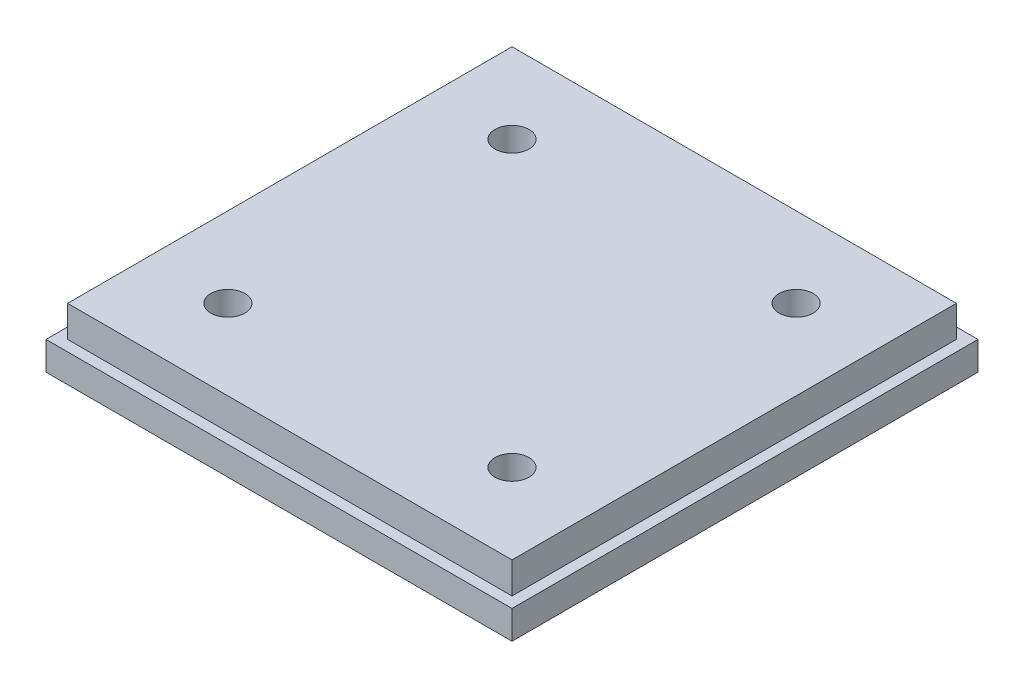
ISO-10303-21;
HEADER;
FILE_DESCRIPTION(('STEP AP214'),'2;1');
FILE_NAME('part.step','',(''),(''),'','','');
FILE_SCHEMA(('AUTOMOTIVE_DESIGN { 1 0 10303 214 1 1 1 1 }'));
ENDSEC;
DATA;
#1=APPLICATION_CONTEXT('core data for automotive mechanical design processes');
#2=APPLICATION_PROTOCOL_DEFINITION('international standard','automotive_design',2000,#1);
#3=PRODUCT_CONTEXT('',#1,'mechanical');
#4=PRODUCT('Part','Part','',(#3));
#5=PRODUCT_RELATED_PRODUCT_CATEGORY('part','',(#4));
#6=PRODUCT_DEFINITION_FORMATION('','',#4);
#7=PRODUCT_DEFINITION_CONTEXT('part definition',#1,'design');
#8=PRODUCT_DEFINITION('design','',#6,#7);
#9=PRODUCT_DEFINITION_SHAPE('','',#8);
#10=(LENGTH_UNIT() NAMED_UNIT(*) SI_UNIT(.MILLI.,.METRE.));
#11=(NAMED_UNIT(*) PLANE_ANGLE_UNIT() SI_UNIT($,.RADIAN.));
#12=(NAMED_UNIT(*) SI_UNIT($,.STERADIAN.) SOLID_ANGLE_UNIT());
#13=UNCERTAINTY_MEASURE_WITH_UNIT(LENGTH_MEASURE(1.E-05),#10,'distance_accuracy_value','');
#14=(GEOMETRIC_REPRESENTATION_CONTEXT(3) GLOBAL_UNCERTAINTY_ASSIGNED_CONTEXT((#13)) GLOBAL_UNIT_ASSIGNED_CONTEXT((#10,
#11,#12)) REPRESENTATION_CONTEXT('',''));
#15=CARTESIAN_POINT('',(0.,0.,0.));
#16=DIRECTION('',(0.,0.,1.));
#17=DIRECTION('',(1.,0.,0.));
#18=AXIS2_PLACEMENT_3D('',#15,#16,#17);
#19=CARTESIAN_POINT('',(0.,5.,0.));
#20=DIRECTION('',(0.,1.,0.));
#21=DIRECTION('',(0.,0.,1.));
#22=AXIS2_PLACEMENT_3D('',#19,#20,#21);
#23=PLANE('',#22);
#24=DIRECTION('',(0.,0.,-1.));
#25=VECTOR('',#24,1.);
#26=CARTESIAN_POINT('',(41.,5.,-41.));
#27=LINE('',#26,#25);
#28=CARTESIAN_POINT('',(41.,5.,41.));
#29=VERTEX_POINT('',#28);
#30=CARTESIAN_POINT('',(41.,5.,-41.));
#31=VERTEX_POINT('',#30);
#32=EDGE_CURVE('E140',#29,#31,#27,.T.);
#33=ORIENTED_EDGE('',*,*,#32,.T.);
#34=DIRECTION('',(-1.,0.,0.));
#35=VECTOR('',#34,1.);
#36=CARTESIAN_POINT('',(-41.,5.,-41.));
#37=LINE('',#36,#35);
#38=CARTESIAN_POINT('',(-41.,5.,-41.));
#39=VERTEX_POINT('',#38);
#40=EDGE_CURVE('E85',#31,#39,#37,.T.);
#41=ORIENTED_EDGE('',*,*,#40,.T.);
#42=DIRECTION('',(0.,0.,1.));
#43=VECTOR('',#42,1.);
#44=CARTESIAN_POINT('',(-41.,5.,-41.));
#45=LINE('',#44,#43);
#46=CARTESIAN_POINT('',(-41.,5.,41.));
#47=VERTEX_POINT('',#46);
#48=EDGE_CURVE('E143',#39,#47,#45,.T.);
#49=ORIENTED_EDGE('',*,*,#48,.T.);
#50=DIRECTION('',(1.,0.,0.));
#51=VECTOR('',#50,1.);
#52=CARTESIAN_POINT('',(-41.,5.,41.));
#53=LINE('',#52,#51);
#54=EDGE_CURVE('E57',#47,#29,#53,.T.);
#55=ORIENTED_EDGE('',*,*,#54,.T.);
#56=EDGE_LOOP('',(#33,#41,#49,#55));
#57=FACE_BOUND('',#56,.T.);
#58=DIRECTION('',(0.,0.,-1.));
#59=VECTOR('',#58,1.);
#60=CARTESIAN_POINT('',(39.1,5.,39.1));
#61=LINE('',#60,#59);
#62=CARTESIAN_POINT('',(39.1,5.,39.1));
#63=VERTEX_POINT('',#62);
#64=CARTESIAN_POINT('',(39.1,5.,-39.1));
#65=VERTEX_POINT('',#64);
#66=EDGE_CURVE('E259',#63,#65,#61,.T.);
#67=ORIENTED_EDGE('',*,*,#66,.F.);
#68=DIRECTION('',(1.,0.,0.));
#69=VECTOR('',#68,1.);
#70=CARTESIAN_POINT('',(-39.1,5.,39.1));
#71=LINE('',#70,#69);
#72=CARTESIAN_POINT('',(-39.1,5.,39.1));
#73=VERTEX_POINT('',#72);
#74=EDGE_CURVE('E130',#73,#63,#71,.T.);
#75=ORIENTED_EDGE('',*,*,#74,.F.);
#76=DIRECTION('',(0.,0.,1.));
#77=VECTOR('',#76,1.);
#78=CARTESIAN_POINT('',(-39.1,5.,-39.1));
#79=LINE('',#78,#77);
#80=CARTESIAN_POINT('',(-39.1,5.,-39.1));
#81=VERTEX_POINT('',#80);
#82=EDGE_CURVE('E126',#81,#73,#79,.T.);
#83=ORIENTED_EDGE('',*,*,#82,.F.);
#84=DIRECTION('',(-1.,0.,0.));
#85=VECTOR('',#84,1.);
#86=CARTESIAN_POINT('',(39.1,5.,-39.1));
#87=LINE('',#86,#85);
#88=EDGE_CURVE('E261',#65,#81,#87,.T.);
#89=ORIENTED_EDGE('',*,*,#88,.F.);
#90=EDGE_LOOP('',(#67,#75,#83,#89));
#91=FACE_BOUND('',#90,.T.);
#92=ADVANCED_FACE('F33',(#57,#91),#23,.T.);
#93=CARTESIAN_POINT('',(41.,5.,-41.));
#94=DIRECTION('',(-1.,0.,0.));
#95=DIRECTION('',(0.,0.,1.));
#96=AXIS2_PLACEMENT_3D('',#93,#94,#95);
#97=PLANE('',#96);
#98=DIRECTION('',(0.,0.,-1.));
#99=VECTOR('',#98,1.);
#100=CARTESIAN_POINT('',(41.,0.,-41.));
#101=LINE('',#100,#99);
#102=CARTESIAN_POINT('',(41.,0.,41.));
#103=VERTEX_POINT('',#102);
#104=CARTESIAN_POINT('',(41.,0.,-41.));
#105=VERTEX_POINT('',#104);
#106=EDGE_CURVE('E132',#103,#105,#101,.T.);
#107=ORIENTED_EDGE('',*,*,#106,.T.);
#108=DIRECTION('',(0.,-1.,0.));
#109=VECTOR('',#108,1.);
#110=CARTESIAN_POINT('',(41.,5.,-41.));
#111=LINE('',#110,#109);
#112=EDGE_CURVE('E11',#31,#105,#111,.T.);
#113=ORIENTED_EDGE('',*,*,#112,.F.);
#114=ORIENTED_EDGE('',*,*,#32,.F.);
#115=DIRECTION('',(0.,-1.,0.));
#116=VECTOR('',#115,1.);
#117=CARTESIAN_POINT('',(41.,5.,41.));
#118=LINE('',#117,#116);
#119=EDGE_CURVE('E145',#29,#103,#118,.T.);
#120=ORIENTED_EDGE('',*,*,#119,.T.);
#121=EDGE_LOOP('',(#107,#113,#114,#120));
#122=FACE_BOUND('',#121,.T.);
#123=ADVANCED_FACE('F35',(#122),#97,.F.);
#124=CARTESIAN_POINT('',(-41.,5.,-41.));
#125=DIRECTION('',(0.,0.,1.));
#126=DIRECTION('',(1.,0.,0.));
#127=AXIS2_PLACEMENT_3D('',#124,#125,#126);
#128=PLANE('',#127);
#129=DIRECTION('',(-1.,0.,0.));
#130=VECTOR('',#129,1.);
#131=CARTESIAN_POINT('',(-41.,0.,-41.));
#132=LINE('',#131,#130);
#133=CARTESIAN_POINT('',(-41.,0.,-41.));
#134=VERTEX_POINT('',#133);
#135=EDGE_CURVE('E135',#105,#134,#132,.T.);
#136=ORIENTED_EDGE('',*,*,#135,.T.);
#137=DIRECTION('',(0.,-1.,0.));
#138=VECTOR('',#137,1.);
#139=CARTESIAN_POINT('',(-41.,5.,-41.));
#140=LINE('',#139,#138);
#141=EDGE_CURVE('E41',#39,#134,#140,.T.);
#142=ORIENTED_EDGE('',*,*,#141,.F.);
#143=ORIENTED_EDGE('',*,*,#40,.F.);
#144=ORIENTED_EDGE('',*,*,#112,.T.);
#145=EDGE_LOOP('',(#136,#142,#143,#144));
#146=FACE_BOUND('',#145,.T.);
#147=ADVANCED_FACE('F173',(#146),#128,.F.);
#148=CARTESIAN_POINT('',(-41.,5.,-41.));
#149=DIRECTION('',(1.,0.,0.));
#150=DIRECTION('',(0.,0.,-1.));
#151=AXIS2_PLACEMENT_3D('',#148,#149,#150);
#152=PLANE('',#151);
#153=DIRECTION('',(0.,0.,1.));
#154=VECTOR('',#153,1.);
#155=CARTESIAN_POINT('',(-41.,0.,-41.));
#156=LINE('',#155,#154);
#157=CARTESIAN_POINT('',(-41.,0.,41.));
#158=VERTEX_POINT('',#157);
#159=EDGE_CURVE('E148',#134,#158,#156,.T.);
#160=ORIENTED_EDGE('',*,*,#159,.T.);
#161=DIRECTION('',(0.,-1.,0.));
#162=VECTOR('',#161,1.);
#163=CARTESIAN_POINT('',(-41.,5.,41.));
#164=LINE('',#163,#162);
#165=EDGE_CURVE('E152',#47,#158,#164,.T.);
#166=ORIENTED_EDGE('',*,*,#165,.F.);
#167=ORIENTED_EDGE('',*,*,#48,.F.);
#168=ORIENTED_EDGE('',*,*,#141,.T.);
#169=EDGE_LOOP('',(#160,#166,#167,#168));
#170=FACE_BOUND('',#169,.T.);
#171=ADVANCED_FACE('F157',(#170),#152,.F.);
#172=CARTESIAN_POINT('',(-41.,5.,41.));
#173=DIRECTION('',(0.,0.,-1.));
#174=DIRECTION('',(-1.,0.,0.));
#175=AXIS2_PLACEMENT_3D('',#172,#173,#174);
#176=PLANE('',#175);
#177=DIRECTION('',(1.,0.,0.));
#178=VECTOR('',#177,1.);
#179=CARTESIAN_POINT('',(-41.,0.,41.));
#180=LINE('',#179,#178);
#181=EDGE_CURVE('E78',#158,#103,#180,.T.);
#182=ORIENTED_EDGE('',*,*,#181,.T.);
#183=ORIENTED_EDGE('',*,*,#119,.F.);
#184=ORIENTED_EDGE('',*,*,#54,.F.);
#185=ORIENTED_EDGE('',*,*,#165,.T.);
#186=EDGE_LOOP('',(#182,#183,#184,#185));
#187=FACE_BOUND('',#186,.T.);
#188=ADVANCED_FACE('F165',(#187),#176,.F.);
#189=CARTESIAN_POINT('',(0.,0.,0.));
#190=DIRECTION('',(0.,1.,0.));
#191=DIRECTION('',(0.,0.,1.));
#192=AXIS2_PLACEMENT_3D('',#189,#190,#191);
#193=PLANE('',#192);
#194=ORIENTED_EDGE('',*,*,#106,.F.);
#195=ORIENTED_EDGE('',*,*,#181,.F.);
#196=ORIENTED_EDGE('',*,*,#159,.F.);
#197=ORIENTED_EDGE('',*,*,#135,.F.);
#198=EDGE_LOOP('',(#194,#195,#196,#197));
#199=FACE_BOUND('',#198,.T.);
#200=ADVANCED_FACE('F161',(#199),#193,.F.);
#201=CARTESIAN_POINT('',(-39.1,10.5,39.1));
#202=DIRECTION('',(0.,0.,-1.));
#203=DIRECTION('',(-1.,0.,0.));
#204=AXIS2_PLACEMENT_3D('',#201,#202,#203);
#205=PLANE('',#204);
#206=ORIENTED_EDGE('',*,*,#74,.T.);
#207=DIRECTION('',(0.,-1.,0.));
#208=VECTOR('',#207,1.);
#209=CARTESIAN_POINT('',(39.1,10.5,39.1));
#210=LINE('',#209,#208);
#211=CARTESIAN_POINT('',(39.1,10.5,39.1));
#212=VERTEX_POINT('',#211);
#213=EDGE_CURVE('E111',#212,#63,#210,.T.);
#214=ORIENTED_EDGE('',*,*,#213,.F.);
#215=DIRECTION('',(1.,0.,0.));
#216=VECTOR('',#215,1.);
#217=CARTESIAN_POINT('',(-39.1,10.5,39.1));
#218=LINE('',#217,#216);
#219=CARTESIAN_POINT('',(-39.1,10.5,39.1));
#220=VERTEX_POINT('',#219);
#221=EDGE_CURVE('E118',#220,#212,#218,.T.);
#222=ORIENTED_EDGE('',*,*,#221,.F.);
#223=DIRECTION('',(0.,-1.,0.));
#224=VECTOR('',#223,1.);
#225=CARTESIAN_POINT('',(-39.1,10.5,39.1));
#226=LINE('',#225,#224);
#227=EDGE_CURVE('E257',#220,#73,#226,.T.);
#228=ORIENTED_EDGE('',*,*,#227,.T.);
#229=EDGE_LOOP('',(#206,#214,#222,#228));
#230=FACE_BOUND('',#229,.T.);
#231=ADVANCED_FACE('F128',(#230),#205,.F.);
#232=CARTESIAN_POINT('',(39.1,10.5,39.1));
#233=DIRECTION('',(-1.,0.,0.));
#234=DIRECTION('',(0.,0.,1.));
#235=AXIS2_PLACEMENT_3D('',#232,#233,#234);
#236=PLANE('',#235);
#237=ORIENTED_EDGE('',*,*,#66,.T.);
#238=DIRECTION('',(0.,-1.,0.));
#239=VECTOR('',#238,1.);
#240=CARTESIAN_POINT('',(39.1,10.5,-39.1));
#241=LINE('',#240,#239);
#242=CARTESIAN_POINT('',(39.1,10.5,-39.1));
#243=VERTEX_POINT('',#242);
#244=EDGE_CURVE('E114',#243,#65,#241,.T.);
#245=ORIENTED_EDGE('',*,*,#244,.F.);
#246=DIRECTION('',(0.,0.,-1.));
#247=VECTOR('',#246,1.);
#248=CARTESIAN_POINT('',(39.1,10.5,39.1));
#249=LINE('',#248,#247);
#250=EDGE_CURVE('E107',#212,#243,#249,.T.);
#251=ORIENTED_EDGE('',*,*,#250,.F.);
#252=ORIENTED_EDGE('',*,*,#213,.T.);
#253=EDGE_LOOP('',(#237,#245,#251,#252));
#254=FACE_BOUND('',#253,.T.);
#255=ADVANCED_FACE('F109',(#254),#236,.F.);
#256=CARTESIAN_POINT('',(39.1,10.5,-39.1));
#257=DIRECTION('',(0.,0.,1.));
#258=DIRECTION('',(1.,0.,0.));
#259=AXIS2_PLACEMENT_3D('',#256,#257,#258);
#260=PLANE('',#259);
#261=ORIENTED_EDGE('',*,*,#88,.T.);
#262=DIRECTION('',(0.,-1.,0.));
#263=VECTOR('',#262,1.);
#264=CARTESIAN_POINT('',(-39.1,10.5,-39.1));
#265=LINE('',#264,#263);
#266=CARTESIAN_POINT('',(-39.1,10.5,-39.1));
#267=VERTEX_POINT('',#266);
#268=EDGE_CURVE('E48',#267,#81,#265,.T.);
#269=ORIENTED_EDGE('',*,*,#268,.F.);
#270=DIRECTION('',(-1.,0.,0.));
#271=VECTOR('',#270,1.);
#272=CARTESIAN_POINT('',(39.1,10.5,-39.1));
#273=LINE('',#272,#271);
#274=EDGE_CURVE('E117',#243,#267,#273,.T.);
#275=ORIENTED_EDGE('',*,*,#274,.F.);
#276=ORIENTED_EDGE('',*,*,#244,.T.);
#277=EDGE_LOOP('',(#261,#269,#275,#276));
#278=FACE_BOUND('',#277,.T.);
#279=ADVANCED_FACE('F186',(#278),#260,.F.);
#280=CARTESIAN_POINT('',(-39.1,10.5,-39.1));
#281=DIRECTION('',(1.,0.,0.));
#282=DIRECTION('',(0.,0.,-1.));
#283=AXIS2_PLACEMENT_3D('',#280,#281,#282);
#284=PLANE('',#283);
#285=ORIENTED_EDGE('',*,*,#82,.T.);
#286=ORIENTED_EDGE('',*,*,#227,.F.);
#287=DIRECTION('',(0.,0.,1.));
#288=VECTOR('',#287,1.);
#289=CARTESIAN_POINT('',(-39.1,10.5,-39.1));
#290=LINE('',#289,#288);
#291=EDGE_CURVE('E122',#267,#220,#290,.T.);
#292=ORIENTED_EDGE('',*,*,#291,.F.);
#293=ORIENTED_EDGE('',*,*,#268,.T.);
#294=EDGE_LOOP('',(#285,#286,#292,#293));
#295=FACE_BOUND('',#294,.T.);
#296=ADVANCED_FACE('F189',(#295),#284,.F.);
#297=CARTESIAN_POINT('',(0.,10.5,0.));
#298=DIRECTION('',(0.,1.,0.));
#299=DIRECTION('',(0.,0.,1.));
#300=AXIS2_PLACEMENT_3D('',#297,#298,#299);
#301=PLANE('',#300);
#302=CARTESIAN_POINT('',(25.,10.5,-25.));
#303=DIRECTION('',(0.,1.,0.));
#304=DIRECTION('',(0.,0.,-1.));
#305=AXIS2_PLACEMENT_3D('',#302,#303,#304);
#306=CIRCLE('',#305,3.);
#307=CARTESIAN_POINT('',(25.,10.5,-28.));
#308=VERTEX_POINT('',#307);
#309=EDGE_CURVE('E233',#308,#308,#306,.T.);
#310=ORIENTED_EDGE('',*,*,#309,.F.);
#311=EDGE_LOOP('',(#310));
#312=FACE_BOUND('',#311,.T.);
#313=CARTESIAN_POINT('',(25.,10.5,25.));
#314=DIRECTION('',(0.,1.,0.));
#315=DIRECTION('',(0.,0.,1.));
#316=AXIS2_PLACEMENT_3D('',#313,#314,#315);
#317=CIRCLE('',#316,3.);
#318=CARTESIAN_POINT('',(25.,10.5,28.));
#319=VERTEX_POINT('',#318);
#320=EDGE_CURVE('E232',#319,#319,#317,.T.);
#321=ORIENTED_EDGE('',*,*,#320,.F.);
#322=EDGE_LOOP('',(#321));
#323=FACE_BOUND('',#322,.T.);
#324=CARTESIAN_POINT('',(-25.,10.5,25.));
#325=DIRECTION('',(0.,1.,0.));
#326=DIRECTION('',(0.,0.,-1.));
#327=AXIS2_PLACEMENT_3D('',#324,#325,#326);
#328=CIRCLE('',#327,3.);
#329=CARTESIAN_POINT('',(-25.,10.5,22.));
#330=VERTEX_POINT('',#329);
#331=EDGE_CURVE('E242',#330,#330,#328,.T.);
#332=ORIENTED_EDGE('',*,*,#331,.F.);
#333=EDGE_LOOP('',(#332));
#334=FACE_BOUND('',#333,.T.);
#335=CARTESIAN_POINT('',(-25.,10.5,-25.));
#336=DIRECTION('',(0.,1.,0.));
#337=DIRECTION('',(0.,0.,1.));
#338=AXIS2_PLACEMENT_3D('',#335,#336,#337);
#339=CIRCLE('',#338,3.);
#340=CARTESIAN_POINT('',(-25.,10.5,-22.));
#341=VERTEX_POINT('',#340);
#342=EDGE_CURVE('E247',#341,#341,#339,.T.);
#343=ORIENTED_EDGE('',*,*,#342,.F.);
#344=EDGE_LOOP('',(#343));
#345=FACE_BOUND('',#344,.T.);
#346=ORIENTED_EDGE('',*,*,#221,.T.);
#347=ORIENTED_EDGE('',*,*,#250,.T.);
#348=ORIENTED_EDGE('',*,*,#274,.T.);
#349=ORIENTED_EDGE('',*,*,#291,.T.);
#350=EDGE_LOOP('',(#346,#347,#348,#349));
#351=FACE_BOUND('',#350,.T.);
#352=ADVANCED_FACE('F121',(#312,#323,#334,#345,#351),#301,.T.);
#353=CARTESIAN_POINT('',(-25.,2.5,-25.));
#354=DIRECTION('',(0.,1.,0.));
#355=DIRECTION('',(0.,0.,1.));
#356=AXIS2_PLACEMENT_3D('',#353,#354,#355);
#357=CYLINDRICAL_SURFACE('',#356,3.);
#358=CARTESIAN_POINT('',(-25.,2.5,-25.));
#359=DIRECTION('',(0.,1.,0.));
#360=DIRECTION('',(0.,0.,1.));
#361=AXIS2_PLACEMENT_3D('',#358,#359,#360);
#362=CIRCLE('',#361,3.);
#363=CARTESIAN_POINT('',(-25.,2.5,-22.));
#364=VERTEX_POINT('',#363);
#365=EDGE_CURVE('E250',#364,#364,#362,.T.);
#366=ORIENTED_EDGE('',*,*,#365,.F.);
#367=EDGE_LOOP('',(#366));
#368=FACE_BOUND('',#367,.T.);
#369=ORIENTED_EDGE('',*,*,#342,.T.);
#370=EDGE_LOOP('',(#369));
#371=FACE_BOUND('',#370,.T.);
#372=ADVANCED_FACE('F195',(#368,#371),#357,.F.);
#373=CARTESIAN_POINT('',(-25.,2.5,-25.));
#374=DIRECTION('',(0.,1.,0.));
#375=DIRECTION('',(0.,0.,1.));
#376=AXIS2_PLACEMENT_3D('',#373,#374,#375);
#377=PLANE('',#376);
#378=ORIENTED_EDGE('',*,*,#365,.T.);
#379=EDGE_LOOP('',(#378));
#380=FACE_BOUND('',#379,.T.);
#381=ADVANCED_FACE('F199',(#380),#377,.T.);
#382=CARTESIAN_POINT('',(-25.,2.5,25.));
#383=DIRECTION('',(0.,1.,0.));
#384=DIRECTION('',(0.,0.,1.));
#385=AXIS2_PLACEMENT_3D('',#382,#383,#384);
#386=CYLINDRICAL_SURFACE('',#385,3.);
#387=CARTESIAN_POINT('',(-25.,2.5,25.));
#388=DIRECTION('',(0.,1.,0.));
#389=DIRECTION('',(0.,0.,-1.));
#390=AXIS2_PLACEMENT_3D('',#387,#388,#389);
#391=CIRCLE('',#390,3.);
#392=CARTESIAN_POINT('',(-25.,2.5,22.));
#393=VERTEX_POINT('',#392);
#394=EDGE_CURVE('E244',#393,#393,#391,.T.);
#395=ORIENTED_EDGE('',*,*,#394,.F.);
#396=EDGE_LOOP('',(#395));
#397=FACE_BOUND('',#396,.T.);
#398=ORIENTED_EDGE('',*,*,#331,.T.);
#399=EDGE_LOOP('',(#398));
#400=FACE_BOUND('',#399,.T.);
#401=ADVANCED_FACE('F203',(#397,#400),#386,.F.);
#402=CARTESIAN_POINT('',(-25.,2.5,25.));
#403=DIRECTION('',(0.,-1.,0.));
#404=DIRECTION('',(0.,0.,-1.));
#405=AXIS2_PLACEMENT_3D('',#402,#403,#404);
#406=PLANE('',#405);
#407=ORIENTED_EDGE('',*,*,#394,.T.);
#408=EDGE_LOOP('',(#407));
#409=FACE_BOUND('',#408,.T.);
#410=ADVANCED_FACE('F207',(#409),#406,.F.);
#411=CARTESIAN_POINT('',(25.,2.5,25.));
#412=DIRECTION('',(0.,1.,0.));
#413=DIRECTION('',(0.,0.,1.));
#414=AXIS2_PLACEMENT_3D('',#411,#412,#413);
#415=CYLINDRICAL_SURFACE('',#414,3.);
#416=CARTESIAN_POINT('',(25.,2.5,25.));
#417=DIRECTION('',(0.,1.,0.));
#418=DIRECTION('',(0.,0.,1.));
#419=AXIS2_PLACEMENT_3D('',#416,#417,#418);
#420=CIRCLE('',#419,3.);
#421=CARTESIAN_POINT('',(25.,2.5,28.));
#422=VERTEX_POINT('',#421);
#423=EDGE_CURVE('E236',#422,#422,#420,.T.);
#424=ORIENTED_EDGE('',*,*,#423,.F.);
#425=EDGE_LOOP('',(#424));
#426=FACE_BOUND('',#425,.T.);
#427=ORIENTED_EDGE('',*,*,#320,.T.);
#428=EDGE_LOOP('',(#427));
#429=FACE_BOUND('',#428,.T.);
#430=ADVANCED_FACE('F211',(#426,#429),#415,.F.);
#431=CARTESIAN_POINT('',(25.,2.5,25.));
#432=DIRECTION('',(0.,1.,0.));
#433=DIRECTION('',(0.,0.,1.));
#434=AXIS2_PLACEMENT_3D('',#431,#432,#433);
#435=PLANE('',#434);
#436=ORIENTED_EDGE('',*,*,#423,.T.);
#437=EDGE_LOOP('',(#436));
#438=FACE_BOUND('',#437,.T.);
#439=ADVANCED_FACE('F215',(#438),#435,.T.);
#440=CARTESIAN_POINT('',(25.,2.5,-25.));
#441=DIRECTION('',(0.,1.,0.));
#442=DIRECTION('',(0.,0.,1.));
#443=AXIS2_PLACEMENT_3D('',#440,#441,#442);
#444=CYLINDRICAL_SURFACE('',#443,3.);
#445=CARTESIAN_POINT('',(25.,2.5,-25.));
#446=DIRECTION('',(0.,1.,0.));
#447=DIRECTION('',(0.,0.,-1.));
#448=AXIS2_PLACEMENT_3D('',#445,#446,#447);
#449=CIRCLE('',#448,3.);
#450=CARTESIAN_POINT('',(25.,2.5,-28.));
#451=VERTEX_POINT('',#450);
#452=EDGE_CURVE('E231',#451,#451,#449,.T.);
#453=ORIENTED_EDGE('',*,*,#452,.F.);
#454=EDGE_LOOP('',(#453));
#455=FACE_BOUND('',#454,.T.);
#456=ORIENTED_EDGE('',*,*,#309,.T.);
#457=EDGE_LOOP('',(#456));
#458=FACE_BOUND('',#457,.T.);
#459=ADVANCED_FACE('F219',(#455,#458),#444,.F.);
#460=CARTESIAN_POINT('',(25.,2.5,-25.));
#461=DIRECTION('',(0.,-1.,0.));
#462=DIRECTION('',(0.,0.,-1.));
#463=AXIS2_PLACEMENT_3D('',#460,#461,#462);
#464=PLANE('',#463);
#465=ORIENTED_EDGE('',*,*,#452,.T.);
#466=EDGE_LOOP('',(#465));
#467=FACE_BOUND('',#466,.T.);
#468=ADVANCED_FACE('F223',(#467),#464,.F.);
#469=CLOSED_SHELL('',(#92,#123,#147,#171,#188,#200,#231,#255,#279,#296,#352,#372,#381,#401,#410,
#430,#439,#459,#468));
#470=MANIFOLD_SOLID_BREP('B2',#469);
#471=ADVANCED_BREP_SHAPE_REPRESENTATION('',(#18,#470),#14);
#472=SHAPE_DEFINITION_REPRESENTATION(#9,#471);
ENDSEC;
END-ISO-10303-21;
